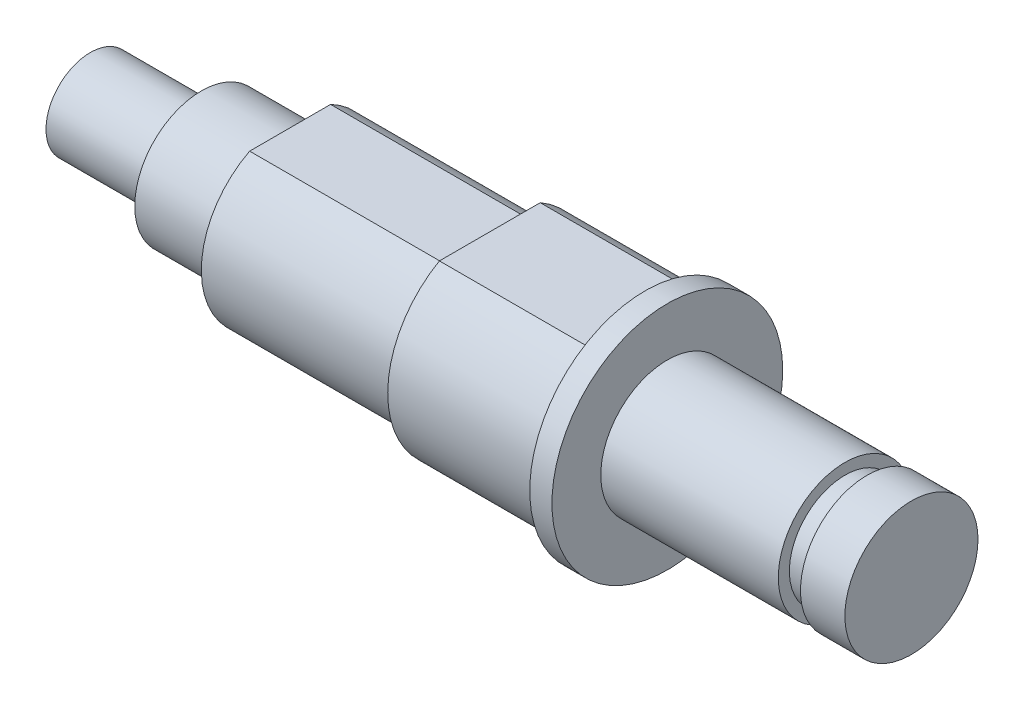
ISO-10303-21;
HEADER;
FILE_DESCRIPTION(('STEP AP214'),'2;1');
FILE_NAME('part.step','',(''),(''),'','','');
FILE_SCHEMA(('AUTOMOTIVE_DESIGN { 1 0 10303 214 1 1 1 1 }'));
ENDSEC;
DATA;
#1=APPLICATION_CONTEXT('core data for automotive mechanical design processes');
#2=APPLICATION_PROTOCOL_DEFINITION('international standard','automotive_design',2000,#1);
#3=PRODUCT_CONTEXT('',#1,'mechanical');
#4=PRODUCT('Part','Part','',(#3));
#5=PRODUCT_RELATED_PRODUCT_CATEGORY('part','',(#4));
#6=PRODUCT_DEFINITION_FORMATION('','',#4);
#7=PRODUCT_DEFINITION_CONTEXT('part definition',#1,'design');
#8=PRODUCT_DEFINITION('design','',#6,#7);
#9=PRODUCT_DEFINITION_SHAPE('','',#8);
#10=(LENGTH_UNIT() NAMED_UNIT(*) SI_UNIT(.MILLI.,.METRE.));
#11=(NAMED_UNIT(*) PLANE_ANGLE_UNIT() SI_UNIT($,.RADIAN.));
#12=(NAMED_UNIT(*) SI_UNIT($,.STERADIAN.) SOLID_ANGLE_UNIT());
#13=UNCERTAINTY_MEASURE_WITH_UNIT(LENGTH_MEASURE(1.E-05),#10,'distance_accuracy_value','');
#14=(GEOMETRIC_REPRESENTATION_CONTEXT(3) GLOBAL_UNCERTAINTY_ASSIGNED_CONTEXT((#13)) GLOBAL_UNIT_ASSIGNED_CONTEXT((#10,
#11,#12)) REPRESENTATION_CONTEXT('',''));
#15=CARTESIAN_POINT('',(0.,0.,0.));
#16=DIRECTION('',(0.,0.,1.));
#17=DIRECTION('',(1.,0.,0.));
#18=AXIS2_PLACEMENT_3D('',#15,#16,#17);
#19=CARTESIAN_POINT('',(18.5,0.,0.));
#20=DIRECTION('',(-1.,0.,0.));
#21=DIRECTION('',(0.,0.,1.));
#22=AXIS2_PLACEMENT_3D('',#19,#20,#21);
#23=CYLINDRICAL_SURFACE('',#22,1.5);
#24=CARTESIAN_POINT('',(4.5,0.,0.));
#25=DIRECTION('',(-1.,0.,0.));
#26=DIRECTION('',(0.,0.,1.));
#27=AXIS2_PLACEMENT_3D('',#24,#25,#26);
#28=CIRCLE('',#27,1.5);
#29=CARTESIAN_POINT('',(4.5,0.,1.5));
#30=VERTEX_POINT('',#29);
#31=EDGE_CURVE('E99',#30,#30,#28,.T.);
#32=ORIENTED_EDGE('',*,*,#31,.T.);
#33=EDGE_LOOP('',(#32));
#34=FACE_BOUND('',#33,.T.);
#35=CARTESIAN_POINT('',(2.5,0.,0.));
#36=DIRECTION('',(-1.,0.,0.));
#37=DIRECTION('',(0.,0.,1.));
#38=AXIS2_PLACEMENT_3D('',#35,#36,#37);
#39=CIRCLE('',#38,1.5);
#40=CARTESIAN_POINT('',(2.5,0.,1.5));
#41=VERTEX_POINT('',#40);
#42=EDGE_CURVE('E38',#41,#41,#39,.T.);
#43=ORIENTED_EDGE('',*,*,#42,.F.);
#44=EDGE_LOOP('',(#43));
#45=FACE_BOUND('',#44,.T.);
#46=ADVANCED_FACE('F35',(#34,#45),#23,.T.);
#47=CARTESIAN_POINT('',(13.,0.,0.));
#48=DIRECTION('',(1.,0.,0.));
#49=DIRECTION('',(0.,0.,-1.));
#50=AXIS2_PLACEMENT_3D('',#47,#48,#49);
#51=CIRCLE('',#50,1.5);
#52=CARTESIAN_POINT('',(13.,0.,-1.5));
#53=VERTEX_POINT('',#52);
#54=EDGE_CURVE('E108',#53,#53,#51,.T.);
#55=ORIENTED_EDGE('',*,*,#54,.T.);
#56=EDGE_LOOP('',(#55));
#57=FACE_BOUND('',#56,.T.);
#58=CARTESIAN_POINT('',(17.,0.,0.));
#59=DIRECTION('',(1.,0.,0.));
#60=DIRECTION('',(0.,0.,-1.));
#61=AXIS2_PLACEMENT_3D('',#58,#59,#60);
#62=CIRCLE('',#61,1.5);
#63=CARTESIAN_POINT('',(17.,0.,-1.5));
#64=VERTEX_POINT('',#63);
#65=EDGE_CURVE('E102',#64,#64,#62,.T.);
#66=ORIENTED_EDGE('',*,*,#65,.F.);
#67=EDGE_LOOP('',(#66));
#68=FACE_BOUND('',#67,.T.);
#69=ADVANCED_FACE('F131',(#57,#68),#23,.T.);
#70=CARTESIAN_POINT('',(9.,0.,0.));
#71=DIRECTION('',(-1.,0.,0.));
#72=DIRECTION('',(0.,0.,1.));
#73=AXIS2_PLACEMENT_3D('',#70,#71,#72);
#74=PLANE('',#73);
#75=CARTESIAN_POINT('',(9.,0.,0.));
#76=DIRECTION('',(-1.,0.,0.));
#77=DIRECTION('',(0.,0.,1.));
#78=AXIS2_PLACEMENT_3D('',#75,#76,#77);
#79=CIRCLE('',#78,2.3);
#80=CARTESIAN_POINT('',(9.,2.,-1.13578166916005));
#81=VERTEX_POINT('',#80);
#82=CARTESIAN_POINT('',(9.,2.,1.13578166916005));
#83=VERTEX_POINT('',#82);
#84=EDGE_CURVE('E115',#81,#83,#79,.T.);
#85=ORIENTED_EDGE('',*,*,#84,.T.);
#86=DIRECTION('',(0.,0.,-1.));
#87=VECTOR('',#86,1.);
#88=CARTESIAN_POINT('',(9.,2.,-1.13578166916005));
#89=LINE('',#88,#87);
#90=EDGE_CURVE('E119',#83,#81,#89,.T.);
#91=ORIENTED_EDGE('',*,*,#90,.T.);
#92=EDGE_LOOP('',(#85,#91));
#93=FACE_BOUND('',#92,.T.);
#94=DIRECTION('',(0.,0.,-1.));
#95=VECTOR('',#94,1.);
#96=CARTESIAN_POINT('',(9.,1.78,-0.91192104921424));
#97=LINE('',#96,#95);
#98=CARTESIAN_POINT('',(9.,1.78,0.91192104921424));
#99=VERTEX_POINT('',#98);
#100=CARTESIAN_POINT('',(9.,1.78,-0.91192104921424));
#101=VERTEX_POINT('',#100);
#102=EDGE_CURVE('E88',#99,#101,#97,.T.);
#103=ORIENTED_EDGE('',*,*,#102,.F.);
#104=CARTESIAN_POINT('',(9.,0.,0.));
#105=DIRECTION('',(-1.,0.,0.));
#106=DIRECTION('',(0.,0.,1.));
#107=AXIS2_PLACEMENT_3D('',#104,#105,#106);
#108=CIRCLE('',#107,2.);
#109=EDGE_CURVE('E50',#101,#99,#108,.T.);
#110=ORIENTED_EDGE('',*,*,#109,.F.);
#111=EDGE_LOOP('',(#103,#110));
#112=FACE_BOUND('',#111,.T.);
#113=ADVANCED_FACE('F98',(#93,#112),#74,.T.);
#114=CARTESIAN_POINT('',(12.5,0.,0.));
#115=DIRECTION('',(-1.,0.,0.));
#116=DIRECTION('',(0.,0.,1.));
#117=AXIS2_PLACEMENT_3D('',#114,#115,#116);
#118=CYLINDRICAL_SURFACE('',#117,2.3);
#119=ORIENTED_EDGE('',*,*,#84,.F.);
#120=DIRECTION('',(-1.,0.,0.));
#121=VECTOR('',#120,1.);
#122=CARTESIAN_POINT('',(12.5,2.,-1.13578166916005));
#123=LINE('',#122,#121);
#124=CARTESIAN_POINT('',(12.5,2.,-1.13578166916005));
#125=VERTEX_POINT('',#124);
#126=EDGE_CURVE('E43',#125,#81,#123,.T.);
#127=ORIENTED_EDGE('',*,*,#126,.F.);
#128=CARTESIAN_POINT('',(12.5,0.,0.));
#129=DIRECTION('',(-1.,0.,0.));
#130=DIRECTION('',(0.,0.,1.));
#131=AXIS2_PLACEMENT_3D('',#128,#129,#130);
#132=CIRCLE('',#131,2.3);
#133=CARTESIAN_POINT('',(12.5,2.,1.13578166916005));
#134=VERTEX_POINT('',#133);
#135=EDGE_CURVE('E58',#125,#134,#132,.T.);
#136=ORIENTED_EDGE('',*,*,#135,.T.);
#137=DIRECTION('',(-1.,0.,0.));
#138=VECTOR('',#137,1.);
#139=CARTESIAN_POINT('',(12.5,2.,1.13578166916005));
#140=LINE('',#139,#138);
#141=EDGE_CURVE('E70',#134,#83,#140,.T.);
#142=ORIENTED_EDGE('',*,*,#141,.T.);
#143=EDGE_LOOP('',(#119,#127,#136,#142));
#144=FACE_BOUND('',#143,.T.);
#145=ADVANCED_FACE('F128',(#144),#118,.T.);
#146=CARTESIAN_POINT('',(12.5,2.,-1.13578166916005));
#147=DIRECTION('',(0.,1.,0.));
#148=DIRECTION('',(0.,0.,1.));
#149=AXIS2_PLACEMENT_3D('',#146,#147,#148);
#150=PLANE('',#149);
#151=ORIENTED_EDGE('',*,*,#90,.F.);
#152=ORIENTED_EDGE('',*,*,#141,.F.);
#153=DIRECTION('',(0.,0.,-1.));
#154=VECTOR('',#153,1.);
#155=CARTESIAN_POINT('',(12.5,2.,-1.13578166916005));
#156=LINE('',#155,#154);
#157=EDGE_CURVE('E74',#134,#125,#156,.T.);
#158=ORIENTED_EDGE('',*,*,#157,.T.);
#159=ORIENTED_EDGE('',*,*,#126,.T.);
#160=EDGE_LOOP('',(#151,#152,#158,#159));
#161=FACE_BOUND('',#160,.T.);
#162=ADVANCED_FACE('F127',(#161),#150,.T.);
#163=CARTESIAN_POINT('',(13.,0.,0.));
#164=DIRECTION('',(1.,0.,0.));
#165=DIRECTION('',(0.,0.,-1.));
#166=AXIS2_PLACEMENT_3D('',#163,#164,#165);
#167=PLANE('',#166);
#168=CARTESIAN_POINT('',(13.,0.,0.));
#169=DIRECTION('',(1.,0.,0.));
#170=DIRECTION('',(0.,0.,-1.));
#171=AXIS2_PLACEMENT_3D('',#168,#169,#170);
#172=CIRCLE('',#171,2.6);
#173=CARTESIAN_POINT('',(13.,0.,-2.6));
#174=VERTEX_POINT('',#173);
#175=EDGE_CURVE('E112',#174,#174,#172,.T.);
#176=ORIENTED_EDGE('',*,*,#175,.T.);
#177=EDGE_LOOP('',(#176));
#178=FACE_BOUND('',#177,.T.);
#179=ORIENTED_EDGE('',*,*,#54,.F.);
#180=EDGE_LOOP('',(#179));
#181=FACE_BOUND('',#180,.T.);
#182=ADVANCED_FACE('F195',(#178,#181),#167,.T.);
#183=CARTESIAN_POINT('',(12.5,0.,0.));
#184=DIRECTION('',(1.,0.,0.));
#185=DIRECTION('',(0.,0.,-1.));
#186=AXIS2_PLACEMENT_3D('',#183,#184,#185);
#187=PLANE('',#186);
#188=ORIENTED_EDGE('',*,*,#135,.F.);
#189=ORIENTED_EDGE('',*,*,#157,.F.);
#190=EDGE_LOOP('',(#188,#189));
#191=FACE_BOUND('',#190,.T.);
#192=CARTESIAN_POINT('',(12.5,0.,0.));
#193=DIRECTION('',(1.,0.,0.));
#194=DIRECTION('',(0.,0.,-1.));
#195=AXIS2_PLACEMENT_3D('',#192,#193,#194);
#196=CIRCLE('',#195,2.6);
#197=CARTESIAN_POINT('',(12.5,0.,-2.6));
#198=VERTEX_POINT('',#197);
#199=EDGE_CURVE('E111',#198,#198,#196,.T.);
#200=ORIENTED_EDGE('',*,*,#199,.F.);
#201=EDGE_LOOP('',(#200));
#202=FACE_BOUND('',#201,.T.);
#203=ADVANCED_FACE('F186',(#191,#202),#187,.F.);
#204=CARTESIAN_POINT('',(13.,0.,0.));
#205=DIRECTION('',(-1.,0.,0.));
#206=DIRECTION('',(0.,0.,1.));
#207=AXIS2_PLACEMENT_3D('',#204,#205,#206);
#208=CYLINDRICAL_SURFACE('',#207,2.6);
#209=ORIENTED_EDGE('',*,*,#175,.F.);
#210=EDGE_LOOP('',(#209));
#211=FACE_BOUND('',#210,.T.);
#212=ORIENTED_EDGE('',*,*,#199,.T.);
#213=EDGE_LOOP('',(#212));
#214=FACE_BOUND('',#213,.T.);
#215=ADVANCED_FACE('F178',(#211,#214),#208,.T.);
#216=CARTESIAN_POINT('',(4.5,0.,0.));
#217=DIRECTION('',(-1.,0.,0.));
#218=DIRECTION('',(0.,0.,1.));
#219=AXIS2_PLACEMENT_3D('',#216,#217,#218);
#220=PLANE('',#219);
#221=CARTESIAN_POINT('',(4.5,0.,0.));
#222=DIRECTION('',(-1.,0.,0.));
#223=DIRECTION('',(0.,0.,1.));
#224=AXIS2_PLACEMENT_3D('',#221,#222,#223);
#225=CIRCLE('',#224,2.);
#226=CARTESIAN_POINT('',(4.5,1.78,-0.91192104921424));
#227=VERTEX_POINT('',#226);
#228=CARTESIAN_POINT('',(4.5,1.78,0.91192104921424));
#229=VERTEX_POINT('',#228);
#230=EDGE_CURVE('E94',#227,#229,#225,.T.);
#231=ORIENTED_EDGE('',*,*,#230,.T.);
#232=DIRECTION('',(0.,0.,-1.));
#233=VECTOR('',#232,1.);
#234=CARTESIAN_POINT('',(4.5,1.78,-0.91192104921424));
#235=LINE('',#234,#233);
#236=EDGE_CURVE('E81',#229,#227,#235,.T.);
#237=ORIENTED_EDGE('',*,*,#236,.T.);
#238=EDGE_LOOP('',(#231,#237));
#239=FACE_BOUND('',#238,.T.);
#240=ORIENTED_EDGE('',*,*,#31,.F.);
#241=EDGE_LOOP('',(#240));
#242=FACE_BOUND('',#241,.T.);
#243=ADVANCED_FACE('F175',(#239,#242),#220,.T.);
#244=CARTESIAN_POINT('',(4.5,0.,0.));
#245=DIRECTION('',(1.,0.,0.));
#246=DIRECTION('',(0.,0.,-1.));
#247=AXIS2_PLACEMENT_3D('',#244,#245,#246);
#248=CYLINDRICAL_SURFACE('',#247,2.);
#249=ORIENTED_EDGE('',*,*,#109,.T.);
#250=DIRECTION('',(1.,0.,0.));
#251=VECTOR('',#250,1.);
#252=CARTESIAN_POINT('',(4.5,1.78,0.91192104921424));
#253=LINE('',#252,#251);
#254=EDGE_CURVE('E92',#229,#99,#253,.T.);
#255=ORIENTED_EDGE('',*,*,#254,.F.);
#256=ORIENTED_EDGE('',*,*,#230,.F.);
#257=DIRECTION('',(1.,0.,0.));
#258=VECTOR('',#257,1.);
#259=CARTESIAN_POINT('',(4.5,1.78,-0.91192104921424));
#260=LINE('',#259,#258);
#261=EDGE_CURVE('E90',#227,#101,#260,.T.);
#262=ORIENTED_EDGE('',*,*,#261,.T.);
#263=EDGE_LOOP('',(#249,#255,#256,#262));
#264=FACE_BOUND('',#263,.T.);
#265=ADVANCED_FACE('F96',(#264),#248,.T.);
#266=CARTESIAN_POINT('',(4.5,1.78,-0.91192104921424));
#267=DIRECTION('',(0.,-1.,0.));
#268=DIRECTION('',(0.,0.,-1.));
#269=AXIS2_PLACEMENT_3D('',#266,#267,#268);
#270=PLANE('',#269);
#271=ORIENTED_EDGE('',*,*,#102,.T.);
#272=ORIENTED_EDGE('',*,*,#261,.F.);
#273=ORIENTED_EDGE('',*,*,#236,.F.);
#274=ORIENTED_EDGE('',*,*,#254,.T.);
#275=EDGE_LOOP('',(#271,#272,#273,#274));
#276=FACE_BOUND('',#275,.T.);
#277=ADVANCED_FACE('F89',(#276),#270,.F.);
#278=CARTESIAN_POINT('',(17.,0.,0.));
#279=DIRECTION('',(1.,0.,0.));
#280=DIRECTION('',(0.,0.,-1.));
#281=AXIS2_PLACEMENT_3D('',#278,#279,#280);
#282=PLANE('',#281);
#283=CARTESIAN_POINT('',(17.,0.,0.));
#284=DIRECTION('',(1.,0.,0.));
#285=DIRECTION('',(0.,0.,-1.));
#286=AXIS2_PLACEMENT_3D('',#283,#284,#285);
#287=CIRCLE('',#286,1.25);
#288=CARTESIAN_POINT('',(17.,0.,-1.25));
#289=VERTEX_POINT('',#288);
#290=EDGE_CURVE('E167',#289,#289,#287,.T.);
#291=ORIENTED_EDGE('',*,*,#290,.F.);
#292=EDGE_LOOP('',(#291));
#293=FACE_BOUND('',#292,.T.);
#294=ORIENTED_EDGE('',*,*,#65,.T.);
#295=EDGE_LOOP('',(#294));
#296=FACE_BOUND('',#295,.T.);
#297=ADVANCED_FACE('F193',(#293,#296),#282,.T.);
#298=CARTESIAN_POINT('',(17.5,0.,0.));
#299=DIRECTION('',(1.,0.,0.));
#300=DIRECTION('',(0.,0.,-1.));
#301=AXIS2_PLACEMENT_3D('',#298,#299,#300);
#302=PLANE('',#301);
#303=CARTESIAN_POINT('',(17.5,0.,0.));
#304=DIRECTION('',(1.,0.,0.));
#305=DIRECTION('',(0.,0.,-1.));
#306=AXIS2_PLACEMENT_3D('',#303,#304,#305);
#307=CIRCLE('',#306,1.25);
#308=CARTESIAN_POINT('',(17.5,0.,-1.25));
#309=VERTEX_POINT('',#308);
#310=EDGE_CURVE('E172',#309,#309,#307,.T.);
#311=ORIENTED_EDGE('',*,*,#310,.T.);
#312=EDGE_LOOP('',(#311));
#313=FACE_BOUND('',#312,.T.);
#314=CARTESIAN_POINT('',(17.5,0.,0.));
#315=DIRECTION('',(1.,0.,0.));
#316=DIRECTION('',(0.,0.,-1.));
#317=AXIS2_PLACEMENT_3D('',#314,#315,#316);
#318=CIRCLE('',#317,1.5);
#319=CARTESIAN_POINT('',(17.5,0.,-1.5));
#320=VERTEX_POINT('',#319);
#321=EDGE_CURVE('E164',#320,#320,#318,.T.);
#322=ORIENTED_EDGE('',*,*,#321,.F.);
#323=EDGE_LOOP('',(#322));
#324=FACE_BOUND('',#323,.T.);
#325=ADVANCED_FACE('F190',(#313,#324),#302,.F.);
#326=CARTESIAN_POINT('',(17.,0.,0.));
#327=DIRECTION('',(1.,0.,0.));
#328=DIRECTION('',(0.,0.,-1.));
#329=AXIS2_PLACEMENT_3D('',#326,#327,#328);
#330=CYLINDRICAL_SURFACE('',#329,1.25);
#331=ORIENTED_EDGE('',*,*,#290,.T.);
#332=EDGE_LOOP('',(#331));
#333=FACE_BOUND('',#332,.T.);
#334=ORIENTED_EDGE('',*,*,#310,.F.);
#335=EDGE_LOOP('',(#334));
#336=FACE_BOUND('',#335,.T.);
#337=ADVANCED_FACE('F158',(#333,#336),#330,.T.);
#338=CARTESIAN_POINT('',(18.5,0.,0.));
#339=DIRECTION('',(1.,0.,0.));
#340=DIRECTION('',(0.,0.,-1.));
#341=AXIS2_PLACEMENT_3D('',#338,#339,#340);
#342=PLANE('',#341);
#343=CARTESIAN_POINT('',(18.5,0.,0.));
#344=DIRECTION('',(1.,0.,0.));
#345=DIRECTION('',(0.,0.,-1.));
#346=AXIS2_PLACEMENT_3D('',#343,#344,#345);
#347=CIRCLE('',#346,1.5);
#348=CARTESIAN_POINT('',(18.5,0.,-1.5));
#349=VERTEX_POINT('',#348);
#350=EDGE_CURVE('E11',#349,#349,#347,.T.);
#351=ORIENTED_EDGE('',*,*,#350,.T.);
#352=EDGE_LOOP('',(#351));
#353=FACE_BOUND('',#352,.T.);
#354=ADVANCED_FACE('F149',(#353),#342,.T.);
#355=ORIENTED_EDGE('',*,*,#321,.T.);
#356=EDGE_LOOP('',(#355));
#357=FACE_BOUND('',#356,.T.);
#358=ORIENTED_EDGE('',*,*,#350,.F.);
#359=EDGE_LOOP('',(#358));
#360=FACE_BOUND('',#359,.T.);
#361=ADVANCED_FACE('F139',(#357,#360),#23,.T.);
#362=CARTESIAN_POINT('',(2.5,0.,0.));
#363=DIRECTION('',(-1.,0.,0.));
#364=DIRECTION('',(0.,0.,1.));
#365=AXIS2_PLACEMENT_3D('',#362,#363,#364);
#366=PLANE('',#365);
#367=CARTESIAN_POINT('',(2.5,0.,0.));
#368=DIRECTION('',(-1.,0.,0.));
#369=DIRECTION('',(0.,0.,1.));
#370=AXIS2_PLACEMENT_3D('',#367,#368,#369);
#371=CIRCLE('',#370,1.);
#372=CARTESIAN_POINT('',(2.5,0.,1.));
#373=VERTEX_POINT('',#372);
#374=EDGE_CURVE('E327',#373,#373,#371,.T.);
#375=ORIENTED_EDGE('',*,*,#374,.F.);
#376=EDGE_LOOP('',(#375));
#377=FACE_BOUND('',#376,.T.);
#378=ORIENTED_EDGE('',*,*,#42,.T.);
#379=EDGE_LOOP('',(#378));
#380=FACE_BOUND('',#379,.T.);
#381=ADVANCED_FACE('F148',(#377,#380),#366,.T.);
#382=CARTESIAN_POINT('',(2.5,0.,0.));
#383=DIRECTION('',(-1.,0.,0.));
#384=DIRECTION('',(0.,0.,1.));
#385=AXIS2_PLACEMENT_3D('',#382,#383,#384);
#386=CYLINDRICAL_SURFACE('',#385,1.);
#387=ORIENTED_EDGE('',*,*,#374,.T.);
#388=EDGE_LOOP('',(#387));
#389=FACE_BOUND('',#388,.T.);
#390=CARTESIAN_POINT('',(0.,0.,0.));
#391=DIRECTION('',(-1.,0.,0.));
#392=DIRECTION('',(0.,0.,1.));
#393=AXIS2_PLACEMENT_3D('',#390,#391,#392);
#394=CIRCLE('',#393,1.);
#395=CARTESIAN_POINT('',(0.,0.,1.));
#396=VERTEX_POINT('',#395);
#397=EDGE_CURVE('E325',#396,#396,#394,.T.);
#398=ORIENTED_EDGE('',*,*,#397,.F.);
#399=EDGE_LOOP('',(#398));
#400=FACE_BOUND('',#399,.T.);
#401=ADVANCED_FACE('F155',(#389,#400),#386,.T.);
#402=CARTESIAN_POINT('',(0.,0.,0.));
#403=DIRECTION('',(1.,0.,0.));
#404=DIRECTION('',(0.,0.,-1.));
#405=AXIS2_PLACEMENT_3D('',#402,#403,#404);
#406=PLANE('',#405);
#407=ORIENTED_EDGE('',*,*,#397,.T.);
#408=EDGE_LOOP('',(#407));
#409=FACE_BOUND('',#408,.T.);
#410=ADVANCED_FACE('F289',(#409),#406,.F.);
#411=CLOSED_SHELL('',(#46,#69,#113,#145,#162,#182,#203,#215,#243,#265,#277,#297,#325,#337,#354,
#361,#381,#401,#410));
#412=MANIFOLD_SOLID_BREP('B2',#411);
#413=ADVANCED_BREP_SHAPE_REPRESENTATION('',(#18,#412),#14);
#414=SHAPE_DEFINITION_REPRESENTATION(#9,#413);
ENDSEC;
END-ISO-10303-21;
